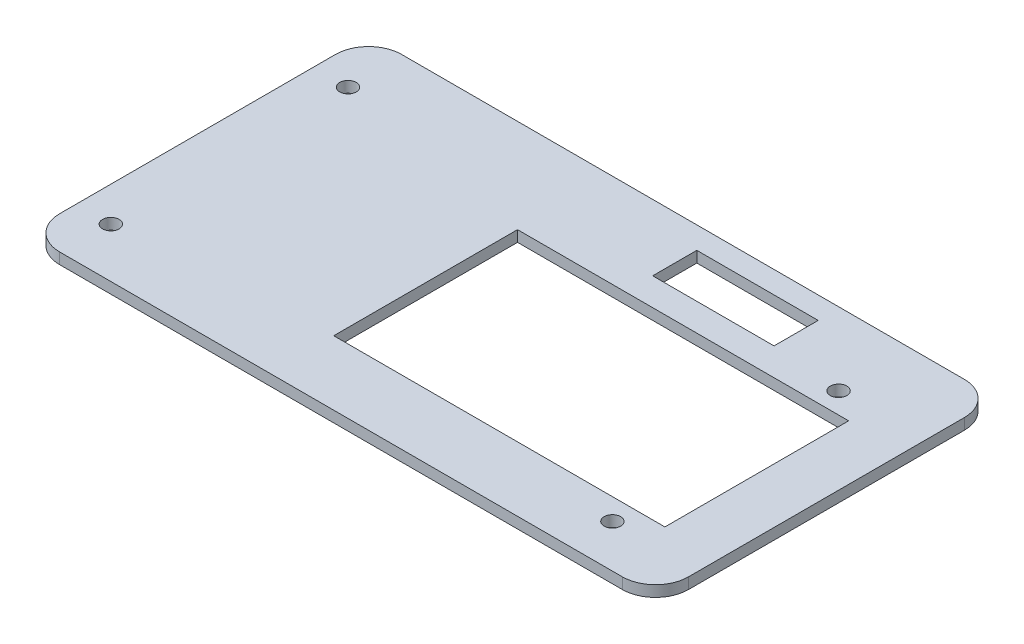
ISO-10303-21;
HEADER;
FILE_DESCRIPTION(('STEP AP214'),'2;1');
FILE_NAME('part.step','',(''),(''),'','','');
FILE_SCHEMA(('AUTOMOTIVE_DESIGN { 1 0 10303 214 1 1 1 1 }'));
ENDSEC;
DATA;
#1=APPLICATION_CONTEXT('core data for automotive mechanical design processes');
#2=APPLICATION_PROTOCOL_DEFINITION('international standard','automotive_design',2000,#1);
#3=PRODUCT_CONTEXT('',#1,'mechanical');
#4=PRODUCT('Part','Part','',(#3));
#5=PRODUCT_RELATED_PRODUCT_CATEGORY('part','',(#4));
#6=PRODUCT_DEFINITION_FORMATION('','',#4);
#7=PRODUCT_DEFINITION_CONTEXT('part definition',#1,'design');
#8=PRODUCT_DEFINITION('design','',#6,#7);
#9=PRODUCT_DEFINITION_SHAPE('','',#8);
#10=(LENGTH_UNIT() NAMED_UNIT(*) SI_UNIT(.MILLI.,.METRE.));
#11=(NAMED_UNIT(*) PLANE_ANGLE_UNIT() SI_UNIT($,.RADIAN.));
#12=(NAMED_UNIT(*) SI_UNIT($,.STERADIAN.) SOLID_ANGLE_UNIT());
#13=UNCERTAINTY_MEASURE_WITH_UNIT(LENGTH_MEASURE(1.E-05),#10,'distance_accuracy_value','');
#14=(GEOMETRIC_REPRESENTATION_CONTEXT(3) GLOBAL_UNCERTAINTY_ASSIGNED_CONTEXT((#13)) GLOBAL_UNIT_ASSIGNED_CONTEXT((#10,
#11,#12)) REPRESENTATION_CONTEXT('',''));
#15=CARTESIAN_POINT('',(0.,0.,0.));
#16=DIRECTION('',(0.,0.,1.));
#17=DIRECTION('',(1.,0.,0.));
#18=AXIS2_PLACEMENT_3D('',#15,#16,#17);
#19=CARTESIAN_POINT('',(0.,2.00000000000009,0.));
#20=DIRECTION('',(0.,-0.999999999999999,0.));
#21=DIRECTION('',(0.,0.,-0.999999999999998));
#22=AXIS2_PLACEMENT_3D('',#19,#20,#21);
#23=PLANE('',#22);
#24=CARTESIAN_POINT('',(15.9,2.00000000000007,-17.8));
#25=DIRECTION('',(0.,-0.999999999999999,0.));
#26=DIRECTION('',(0.,0.,-0.999999999999998));
#27=AXIS2_PLACEMENT_3D('',#24,#25,#26);
#28=CIRCLE('',#27,1.5);
#29=CARTESIAN_POINT('',(15.9,2.00000000000007,-16.3));
#30=VERTEX_POINT('',#29);
#31=EDGE_CURVE('E273',#30,#30,#28,.T.);
#32=ORIENTED_EDGE('',*,*,#31,.T.);
#33=EDGE_LOOP('',(#32));
#34=FACE_BOUND('',#33,.T.);
#35=CARTESIAN_POINT('',(15.8999999999999,2.00000000000009,23.2));
#36=DIRECTION('',(0.,-0.999999999999999,0.));
#37=DIRECTION('',(0.,0.,-0.999999999999998));
#38=AXIS2_PLACEMENT_3D('',#35,#36,#37);
#39=CIRCLE('',#38,1.5);
#40=CARTESIAN_POINT('',(15.8999999999999,2.00000000000009,24.7));
#41=VERTEX_POINT('',#40);
#42=EDGE_CURVE('E269',#41,#41,#39,.T.);
#43=ORIENTED_EDGE('',*,*,#42,.T.);
#44=EDGE_LOOP('',(#43));
#45=FACE_BOUND('',#44,.T.);
#46=CARTESIAN_POINT('',(-76.22,2.,-21.));
#47=DIRECTION('',(0.,-0.999999999999999,0.));
#48=DIRECTION('',(0.,0.,-0.999999999999998));
#49=AXIS2_PLACEMENT_3D('',#46,#47,#48);
#50=CIRCLE('',#49,1.5);
#51=CARTESIAN_POINT('',(-76.22,2.,-19.5));
#52=VERTEX_POINT('',#51);
#53=EDGE_CURVE('E265',#52,#52,#50,.T.);
#54=ORIENTED_EDGE('',*,*,#53,.T.);
#55=EDGE_LOOP('',(#54));
#56=FACE_BOUND('',#55,.T.);
#57=CARTESIAN_POINT('',(-76.22,2.00000000000009,22.));
#58=DIRECTION('',(0.,-0.999999999999999,0.));
#59=DIRECTION('',(0.,0.,-0.999999999999998));
#60=AXIS2_PLACEMENT_3D('',#57,#58,#59);
#61=CIRCLE('',#60,1.5);
#62=CARTESIAN_POINT('',(-76.22,2.00000000000009,23.5000000000001));
#63=VERTEX_POINT('',#62);
#64=EDGE_CURVE('E189',#63,#63,#61,.T.);
#65=ORIENTED_EDGE('',*,*,#64,.T.);
#66=EDGE_LOOP('',(#65));
#67=FACE_BOUND('',#66,.T.);
#68=DIRECTION('',(0.,0.,0.999999999999998));
#69=VECTOR('',#68,1.);
#70=CARTESIAN_POINT('',(-38.5,2.,19.3123275634379));
#71=LINE('',#70,#69);
#72=CARTESIAN_POINT('',(-38.5,2.,-13.9999999999999));
#73=VERTEX_POINT('',#72);
#74=CARTESIAN_POINT('',(-38.5,2.,19.3123275634379));
#75=VERTEX_POINT('',#74);
#76=EDGE_CURVE('E201',#73,#75,#71,.T.);
#77=ORIENTED_EDGE('',*,*,#76,.F.);
#78=DIRECTION('',(-0.999999999999999,0.,0.));
#79=VECTOR('',#78,1.);
#80=CARTESIAN_POINT('',(-38.5,2.,-13.9999999999999));
#81=LINE('',#80,#79);
#82=CARTESIAN_POINT('',(21.5265571823158,2.,-14.));
#83=VERTEX_POINT('',#82);
#84=EDGE_CURVE('E209',#83,#73,#81,.T.);
#85=ORIENTED_EDGE('',*,*,#84,.F.);
#86=DIRECTION('',(0.,0.,-0.999999999999998));
#87=VECTOR('',#86,1.);
#88=CARTESIAN_POINT('',(21.5265571823158,2.00000000000009,19.3123275634379));
#89=LINE('',#88,#87);
#90=CARTESIAN_POINT('',(21.5265571823158,2.00000000000009,19.3123275634379));
#91=VERTEX_POINT('',#90);
#92=EDGE_CURVE('E206',#91,#83,#89,.T.);
#93=ORIENTED_EDGE('',*,*,#92,.F.);
#94=DIRECTION('',(0.999999999999999,0.,0.));
#95=VECTOR('',#94,1.);
#96=CARTESIAN_POINT('',(-38.5,2.,19.3123275634379));
#97=LINE('',#96,#95);
#98=EDGE_CURVE('E203',#75,#91,#97,.T.);
#99=ORIENTED_EDGE('',*,*,#98,.F.);
#100=EDGE_LOOP('',(#77,#85,#93,#99));
#101=FACE_BOUND('',#100,.T.);
#102=DIRECTION('',(0.,0.,-0.999999999999998));
#103=VECTOR('',#102,1.);
#104=CARTESIAN_POINT('',(31.5,2.,-30.9999999999999));
#105=LINE('',#104,#103);
#106=CARTESIAN_POINT('',(31.5,2.00000000000009,25.));
#107=VERTEX_POINT('',#106);
#108=CARTESIAN_POINT('',(31.5000000000001,2.00000000000009,-25.));
#109=VERTEX_POINT('',#108);
#110=EDGE_CURVE('E235',#107,#109,#105,.T.);
#111=ORIENTED_EDGE('',*,*,#110,.T.);
#112=CARTESIAN_POINT('',(25.5,2.,-25.));
#113=DIRECTION('',(0.,-0.999999999999999,0.));
#114=DIRECTION('',(0.,0.,-0.999999999999998));
#115=AXIS2_PLACEMENT_3D('',#112,#113,#114);
#116=CIRCLE('',#115,6.);
#117=CARTESIAN_POINT('',(25.5,2.00000000000007,-30.9999999999999));
#118=VERTEX_POINT('',#117);
#119=EDGE_CURVE('E296',#109,#118,#116,.F.);
#120=ORIENTED_EDGE('',*,*,#119,.T.);
#121=DIRECTION('',(-0.999999999999999,0.,0.));
#122=VECTOR('',#121,1.);
#123=CARTESIAN_POINT('',(31.5,2.,-30.9999999999999));
#124=LINE('',#123,#122);
#125=CARTESIAN_POINT('',(-76.5,2.00000000000009,-30.9999999999998));
#126=VERTEX_POINT('',#125);
#127=EDGE_CURVE('E239',#118,#126,#124,.T.);
#128=ORIENTED_EDGE('',*,*,#127,.T.);
#129=CARTESIAN_POINT('',(-76.5000000000001,2.,-24.9999999999999));
#130=DIRECTION('',(0.,-0.999999999999999,0.));
#131=DIRECTION('',(0.,0.,-0.999999999999998));
#132=AXIS2_PLACEMENT_3D('',#129,#130,#131);
#133=CIRCLE('',#132,6.);
#134=CARTESIAN_POINT('',(-82.5,2.00000000000009,-25.));
#135=VERTEX_POINT('',#134);
#136=EDGE_CURVE('E68',#126,#135,#133,.F.);
#137=ORIENTED_EDGE('',*,*,#136,.T.);
#138=DIRECTION('',(0.,0.,0.999999999999998));
#139=VECTOR('',#138,1.);
#140=CARTESIAN_POINT('',(-82.5,2.,-30.9999999999999));
#141=LINE('',#140,#139);
#142=CARTESIAN_POINT('',(-82.5,2.,25.));
#143=VERTEX_POINT('',#142);
#144=EDGE_CURVE('E241',#135,#143,#141,.T.);
#145=ORIENTED_EDGE('',*,*,#144,.T.);
#146=CARTESIAN_POINT('',(-76.5,2.00000000000009,25.));
#147=DIRECTION('',(0.,-0.999999999999999,0.));
#148=DIRECTION('',(0.,0.,-0.999999999999998));
#149=AXIS2_PLACEMENT_3D('',#146,#147,#148);
#150=CIRCLE('',#149,6.);
#151=CARTESIAN_POINT('',(-76.5000000000002,2.,31.));
#152=VERTEX_POINT('',#151);
#153=EDGE_CURVE('E291',#143,#152,#150,.F.);
#154=ORIENTED_EDGE('',*,*,#153,.T.);
#155=DIRECTION('',(0.999999999999999,0.,0.));
#156=VECTOR('',#155,1.);
#157=CARTESIAN_POINT('',(-82.5,2.,31.0000000000002));
#158=LINE('',#157,#156);
#159=CARTESIAN_POINT('',(25.5,2.00000000000007,31.));
#160=VERTEX_POINT('',#159);
#161=EDGE_CURVE('E232',#152,#160,#158,.T.);
#162=ORIENTED_EDGE('',*,*,#161,.T.);
#163=CARTESIAN_POINT('',(25.5,2.00000000000009,25.));
#164=DIRECTION('',(0.,-0.999999999999999,0.));
#165=DIRECTION('',(0.,0.,-0.999999999999998));
#166=AXIS2_PLACEMENT_3D('',#163,#164,#165);
#167=CIRCLE('',#166,6.);
#168=EDGE_CURVE('E294',#160,#107,#167,.F.);
#169=ORIENTED_EDGE('',*,*,#168,.T.);
#170=EDGE_LOOP('',(#111,#120,#128,#137,#145,#154,#162,#169));
#171=FACE_BOUND('',#170,.T.);
#172=DIRECTION('',(0.,0.,-0.999999999999998));
#173=VECTOR('',#172,1.);
#174=CARTESIAN_POINT('',(-19.,2.00000000000007,-26.9999999999999));
#175=LINE('',#174,#173);
#176=CARTESIAN_POINT('',(-19.,2.00000000000009,-19.));
#177=VERTEX_POINT('',#176);
#178=CARTESIAN_POINT('',(-19.,2.00000000000007,-26.9999999999999));
#179=VERTEX_POINT('',#178);
#180=EDGE_CURVE('E165',#177,#179,#175,.T.);
#181=ORIENTED_EDGE('',*,*,#180,.T.);
#182=DIRECTION('',(0.999999999999999,0.,0.));
#183=VECTOR('',#182,1.);
#184=CARTESIAN_POINT('',(3.,2.,-26.9999999999999));
#185=LINE('',#184,#183);
#186=CARTESIAN_POINT('',(3.,2.,-26.9999999999999));
#187=VERTEX_POINT('',#186);
#188=EDGE_CURVE('E175',#179,#187,#185,.T.);
#189=ORIENTED_EDGE('',*,*,#188,.T.);
#190=DIRECTION('',(0.,0.,0.999999999999998));
#191=VECTOR('',#190,1.);
#192=CARTESIAN_POINT('',(3.,2.,-19.));
#193=LINE('',#192,#191);
#194=CARTESIAN_POINT('',(3.,2.,-19.));
#195=VERTEX_POINT('',#194);
#196=EDGE_CURVE('E181',#187,#195,#193,.T.);
#197=ORIENTED_EDGE('',*,*,#196,.T.);
#198=DIRECTION('',(-0.999999999999999,0.,0.));
#199=VECTOR('',#198,1.);
#200=CARTESIAN_POINT('',(-19.,2.00000000000009,-19.));
#201=LINE('',#200,#199);
#202=EDGE_CURVE('E185',#195,#177,#201,.T.);
#203=ORIENTED_EDGE('',*,*,#202,.T.);
#204=EDGE_LOOP('',(#181,#189,#197,#203));
#205=FACE_BOUND('',#204,.T.);
#206=ADVANCED_FACE('F47',(#34,#45,#56,#67,#101,#171,#205),#23,.F.);
#207=CARTESIAN_POINT('',(0.,0.,0.));
#208=DIRECTION('',(0.,-0.999999999999999,0.));
#209=DIRECTION('',(0.,0.,-0.999999999999998));
#210=AXIS2_PLACEMENT_3D('',#207,#208,#209);
#211=PLANE('',#210);
#212=CARTESIAN_POINT('',(15.8999999999999,0.,-17.7999999999999));
#213=DIRECTION('',(0.,-0.999999999999999,0.));
#214=DIRECTION('',(0.,0.,-0.999999999999998));
#215=AXIS2_PLACEMENT_3D('',#212,#213,#214);
#216=CIRCLE('',#215,1.5);
#217=CARTESIAN_POINT('',(15.9,0.,-16.3));
#218=VERTEX_POINT('',#217);
#219=EDGE_CURVE('E270',#218,#218,#216,.F.);
#220=ORIENTED_EDGE('',*,*,#219,.T.);
#221=EDGE_LOOP('',(#220));
#222=FACE_BOUND('',#221,.T.);
#223=CARTESIAN_POINT('',(15.8999999999999,0.,23.2));
#224=DIRECTION('',(0.,-0.999999999999999,0.));
#225=DIRECTION('',(0.,0.,-0.999999999999998));
#226=AXIS2_PLACEMENT_3D('',#223,#224,#225);
#227=CIRCLE('',#226,1.5);
#228=CARTESIAN_POINT('',(15.8999999999999,0.,24.7));
#229=VERTEX_POINT('',#228);
#230=EDGE_CURVE('E266',#229,#229,#227,.F.);
#231=ORIENTED_EDGE('',*,*,#230,.T.);
#232=EDGE_LOOP('',(#231));
#233=FACE_BOUND('',#232,.T.);
#234=CARTESIAN_POINT('',(-76.22,0.,-21.));
#235=DIRECTION('',(0.,-0.999999999999999,0.));
#236=DIRECTION('',(0.,0.,-0.999999999999998));
#237=AXIS2_PLACEMENT_3D('',#234,#235,#236);
#238=CIRCLE('',#237,1.5);
#239=CARTESIAN_POINT('',(-76.22,0.,-19.5));
#240=VERTEX_POINT('',#239);
#241=EDGE_CURVE('E262',#240,#240,#238,.F.);
#242=ORIENTED_EDGE('',*,*,#241,.T.);
#243=EDGE_LOOP('',(#242));
#244=FACE_BOUND('',#243,.T.);
#245=CARTESIAN_POINT('',(-76.22,0.,21.9999999999999));
#246=DIRECTION('',(0.,-0.999999999999999,0.));
#247=DIRECTION('',(0.,0.,-0.999999999999998));
#248=AXIS2_PLACEMENT_3D('',#245,#246,#247);
#249=CIRCLE('',#248,1.5);
#250=CARTESIAN_POINT('',(-76.22,0.,23.5000000000001));
#251=VERTEX_POINT('',#250);
#252=EDGE_CURVE('E186',#251,#251,#249,.F.);
#253=ORIENTED_EDGE('',*,*,#252,.T.);
#254=EDGE_LOOP('',(#253));
#255=FACE_BOUND('',#254,.T.);
#256=DIRECTION('',(-0.999999999999999,0.,0.));
#257=VECTOR('',#256,1.);
#258=CARTESIAN_POINT('',(-31.5,0.,-30.9999999999999));
#259=LINE('',#258,#257);
#260=CARTESIAN_POINT('',(25.5,0.,-30.9999999999999));
#261=VERTEX_POINT('',#260);
#262=CARTESIAN_POINT('',(-76.5,0.,-30.9999999999998));
#263=VERTEX_POINT('',#262);
#264=EDGE_CURVE('E249',#261,#263,#259,.T.);
#265=ORIENTED_EDGE('',*,*,#264,.F.);
#266=CARTESIAN_POINT('',(25.5,0.,-25.));
#267=DIRECTION('',(0.,-0.999999999999999,0.));
#268=DIRECTION('',(0.,0.,-0.999999999999998));
#269=AXIS2_PLACEMENT_3D('',#266,#267,#268);
#270=CIRCLE('',#269,6.);
#271=CARTESIAN_POINT('',(31.5,0.,-24.9999999999999));
#272=VERTEX_POINT('',#271);
#273=EDGE_CURVE('E284',#261,#272,#270,.T.);
#274=ORIENTED_EDGE('',*,*,#273,.T.);
#275=DIRECTION('',(0.,0.,-0.999999999999998));
#276=VECTOR('',#275,1.);
#277=CARTESIAN_POINT('',(31.5,0.,-30.9999999999998));
#278=LINE('',#277,#276);
#279=CARTESIAN_POINT('',(31.5,0.,25.));
#280=VERTEX_POINT('',#279);
#281=EDGE_CURVE('E246',#280,#272,#278,.T.);
#282=ORIENTED_EDGE('',*,*,#281,.F.);
#283=CARTESIAN_POINT('',(25.5,0.,25.));
#284=DIRECTION('',(0.,-0.999999999999999,0.));
#285=DIRECTION('',(0.,0.,-0.999999999999998));
#286=AXIS2_PLACEMENT_3D('',#283,#284,#285);
#287=CIRCLE('',#286,6.);
#288=CARTESIAN_POINT('',(25.5,0.,31.));
#289=VERTEX_POINT('',#288);
#290=EDGE_CURVE('E282',#280,#289,#287,.T.);
#291=ORIENTED_EDGE('',*,*,#290,.T.);
#292=DIRECTION('',(0.999999999999999,0.,0.));
#293=VECTOR('',#292,1.);
#294=CARTESIAN_POINT('',(-82.5,0.,31.));
#295=LINE('',#294,#293);
#296=CARTESIAN_POINT('',(-76.5000000000001,0.,31.));
#297=VERTEX_POINT('',#296);
#298=EDGE_CURVE('E231',#297,#289,#295,.T.);
#299=ORIENTED_EDGE('',*,*,#298,.F.);
#300=CARTESIAN_POINT('',(-76.5,0.,25.));
#301=DIRECTION('',(0.,-0.999999999999999,0.));
#302=DIRECTION('',(0.,0.,-0.999999999999998));
#303=AXIS2_PLACEMENT_3D('',#300,#301,#302);
#304=CIRCLE('',#303,6.);
#305=CARTESIAN_POINT('',(-82.4999999999999,0.,25.));
#306=VERTEX_POINT('',#305);
#307=EDGE_CURVE('E278',#297,#306,#304,.T.);
#308=ORIENTED_EDGE('',*,*,#307,.T.);
#309=DIRECTION('',(0.,0.,0.999999999999998));
#310=VECTOR('',#309,1.);
#311=CARTESIAN_POINT('',(-82.5,0.,31.));
#312=LINE('',#311,#310);
#313=CARTESIAN_POINT('',(-82.5,0.,-24.9999999999999));
#314=VERTEX_POINT('',#313);
#315=EDGE_CURVE('E236',#314,#306,#312,.T.);
#316=ORIENTED_EDGE('',*,*,#315,.F.);
#317=CARTESIAN_POINT('',(-76.5,0.,-25.));
#318=DIRECTION('',(0.,-0.999999999999999,0.));
#319=DIRECTION('',(0.,0.,-0.999999999999998));
#320=AXIS2_PLACEMENT_3D('',#317,#318,#319);
#321=CIRCLE('',#320,6.);
#322=EDGE_CURVE('E280',#314,#263,#321,.T.);
#323=ORIENTED_EDGE('',*,*,#322,.T.);
#324=EDGE_LOOP('',(#265,#274,#282,#291,#299,#308,#316,#323));
#325=FACE_BOUND('',#324,.T.);
#326=DIRECTION('',(-0.999999999999999,0.,0.));
#327=VECTOR('',#326,1.);
#328=CARTESIAN_POINT('',(-38.5,0.,-14.));
#329=LINE('',#328,#327);
#330=CARTESIAN_POINT('',(21.5265571823158,0.,-14.));
#331=VERTEX_POINT('',#330);
#332=CARTESIAN_POINT('',(-38.5,0.,-14.));
#333=VERTEX_POINT('',#332);
#334=EDGE_CURVE('E204',#331,#333,#329,.T.);
#335=ORIENTED_EDGE('',*,*,#334,.T.);
#336=DIRECTION('',(0.,0.,0.999999999999998));
#337=VECTOR('',#336,1.);
#338=CARTESIAN_POINT('',(-38.5,0.,19.3123275634379));
#339=LINE('',#338,#337);
#340=CARTESIAN_POINT('',(-38.5,0.,19.3123275634379));
#341=VERTEX_POINT('',#340);
#342=EDGE_CURVE('E171',#333,#341,#339,.T.);
#343=ORIENTED_EDGE('',*,*,#342,.T.);
#344=DIRECTION('',(0.999999999999999,0.,0.));
#345=VECTOR('',#344,1.);
#346=CARTESIAN_POINT('',(-38.5,0.,19.3123275634379));
#347=LINE('',#346,#345);
#348=CARTESIAN_POINT('',(21.5265571823158,0.,19.3123275634379));
#349=VERTEX_POINT('',#348);
#350=EDGE_CURVE('E214',#341,#349,#347,.T.);
#351=ORIENTED_EDGE('',*,*,#350,.T.);
#352=DIRECTION('',(0.,0.,-0.999999999999998));
#353=VECTOR('',#352,1.);
#354=CARTESIAN_POINT('',(21.5265571823158,0.,19.3123275634379));
#355=LINE('',#354,#353);
#356=EDGE_CURVE('E217',#349,#331,#355,.T.);
#357=ORIENTED_EDGE('',*,*,#356,.T.);
#358=EDGE_LOOP('',(#335,#343,#351,#357));
#359=FACE_BOUND('',#358,.T.);
#360=DIRECTION('',(-0.999999999999999,0.,0.));
#361=VECTOR('',#360,1.);
#362=CARTESIAN_POINT('',(0.,0.,-26.9999999999998));
#363=LINE('',#362,#361);
#364=CARTESIAN_POINT('',(3.,0.,-26.9999999999998));
#365=VERTEX_POINT('',#364);
#366=CARTESIAN_POINT('',(-19.,0.,-26.9999999999998));
#367=VERTEX_POINT('',#366);
#368=EDGE_CURVE('E258',#365,#367,#363,.T.);
#369=ORIENTED_EDGE('',*,*,#368,.T.);
#370=DIRECTION('',(0.,0.,0.999999999999998));
#371=VECTOR('',#370,1.);
#372=CARTESIAN_POINT('',(-19.,0.,0.));
#373=LINE('',#372,#371);
#374=CARTESIAN_POINT('',(-19.,0.,-19.));
#375=VERTEX_POINT('',#374);
#376=EDGE_CURVE('E168',#367,#375,#373,.T.);
#377=ORIENTED_EDGE('',*,*,#376,.T.);
#378=DIRECTION('',(0.999999999999999,0.,0.));
#379=VECTOR('',#378,1.);
#380=CARTESIAN_POINT('',(0.,0.,-19.));
#381=LINE('',#380,#379);
#382=CARTESIAN_POINT('',(3.,0.,-19.));
#383=VERTEX_POINT('',#382);
#384=EDGE_CURVE('E243',#375,#383,#381,.T.);
#385=ORIENTED_EDGE('',*,*,#384,.T.);
#386=DIRECTION('',(0.,0.,-0.999999999999998));
#387=VECTOR('',#386,1.);
#388=CARTESIAN_POINT('',(3.00000000000004,0.,0.));
#389=LINE('',#388,#387);
#390=EDGE_CURVE('E255',#383,#365,#389,.T.);
#391=ORIENTED_EDGE('',*,*,#390,.T.);
#392=EDGE_LOOP('',(#369,#377,#385,#391));
#393=FACE_BOUND('',#392,.T.);
#394=ADVANCED_FACE('F320',(#222,#233,#244,#255,#325,#359,#393),#211,.T.);
#395=CARTESIAN_POINT('',(-82.5,2.,31.0000000000002));
#396=DIRECTION('',(0.,0.,-0.999999999999998));
#397=DIRECTION('',(-0.999999999999999,0.,0.));
#398=AXIS2_PLACEMENT_3D('',#395,#396,#397);
#399=PLANE('',#398);
#400=ORIENTED_EDGE('',*,*,#298,.T.);
#401=DIRECTION('',(0.,-0.999999999999999,0.));
#402=VECTOR('',#401,1.);
#403=CARTESIAN_POINT('',(25.5,2.00000000000007,31.));
#404=LINE('',#403,#402);
#405=EDGE_CURVE('E301',#289,#160,#404,.F.);
#406=ORIENTED_EDGE('',*,*,#405,.T.);
#407=ORIENTED_EDGE('',*,*,#161,.F.);
#408=DIRECTION('',(0.,-0.999999999999999,0.));
#409=VECTOR('',#408,1.);
#410=CARTESIAN_POINT('',(-76.5000000000002,2.,31.));
#411=LINE('',#410,#409);
#412=EDGE_CURVE('E298',#152,#297,#411,.T.);
#413=ORIENTED_EDGE('',*,*,#412,.T.);
#414=EDGE_LOOP('',(#400,#406,#407,#413));
#415=FACE_BOUND('',#414,.T.);
#416=ADVANCED_FACE('F305',(#415),#399,.F.);
#417=CARTESIAN_POINT('',(31.5,2.,-30.9999999999999));
#418=DIRECTION('',(-0.999999999999999,0.,0.));
#419=DIRECTION('',(0.,0.,0.999999999999998));
#420=AXIS2_PLACEMENT_3D('',#417,#418,#419);
#421=PLANE('',#420);
#422=ORIENTED_EDGE('',*,*,#281,.T.);
#423=DIRECTION('',(0.,-0.999999999999999,0.));
#424=VECTOR('',#423,1.);
#425=CARTESIAN_POINT('',(31.5000000000001,2.00000000000009,-25.));
#426=LINE('',#425,#424);
#427=EDGE_CURVE('E289',#272,#109,#426,.F.);
#428=ORIENTED_EDGE('',*,*,#427,.T.);
#429=ORIENTED_EDGE('',*,*,#110,.F.);
#430=DIRECTION('',(0.,-0.999999999999999,0.));
#431=VECTOR('',#430,1.);
#432=CARTESIAN_POINT('',(31.5,2.00000000000009,25.));
#433=LINE('',#432,#431);
#434=EDGE_CURVE('E286',#107,#280,#433,.T.);
#435=ORIENTED_EDGE('',*,*,#434,.T.);
#436=EDGE_LOOP('',(#422,#428,#429,#435));
#437=FACE_BOUND('',#436,.T.);
#438=ADVANCED_FACE('F316',(#437),#421,.F.);
#439=CARTESIAN_POINT('',(-31.5,2.00000000000009,-30.9999999999999));
#440=DIRECTION('',(0.,0.,0.999999999999998));
#441=DIRECTION('',(0.999999999999999,0.,0.));
#442=AXIS2_PLACEMENT_3D('',#439,#440,#441);
#443=PLANE('',#442);
#444=ORIENTED_EDGE('',*,*,#127,.F.);
#445=DIRECTION('',(0.,-0.999999999999999,0.));
#446=VECTOR('',#445,1.);
#447=CARTESIAN_POINT('',(25.5,2.00000000000007,-30.9999999999999));
#448=LINE('',#447,#446);
#449=EDGE_CURVE('E275',#118,#261,#448,.T.);
#450=ORIENTED_EDGE('',*,*,#449,.T.);
#451=ORIENTED_EDGE('',*,*,#264,.T.);
#452=DIRECTION('',(0.,-0.999999999999999,0.));
#453=VECTOR('',#452,1.);
#454=CARTESIAN_POINT('',(-76.5,2.00000000000009,-30.9999999999998));
#455=LINE('',#454,#453);
#456=EDGE_CURVE('E260',#263,#126,#455,.F.);
#457=ORIENTED_EDGE('',*,*,#456,.T.);
#458=EDGE_LOOP('',(#444,#450,#451,#457));
#459=FACE_BOUND('',#458,.T.);
#460=ADVANCED_FACE('F328',(#459),#443,.F.);
#461=CARTESIAN_POINT('',(-82.5,2.,31.0000000000002));
#462=DIRECTION('',(0.999999999999999,0.,0.));
#463=DIRECTION('',(0.,0.,-0.999999999999998));
#464=AXIS2_PLACEMENT_3D('',#461,#462,#463);
#465=PLANE('',#464);
#466=ORIENTED_EDGE('',*,*,#144,.F.);
#467=DIRECTION('',(0.,-0.999999999999999,0.));
#468=VECTOR('',#467,1.);
#469=CARTESIAN_POINT('',(-82.5,2.00000000000009,-25.));
#470=LINE('',#469,#468);
#471=EDGE_CURVE('E13',#135,#314,#470,.T.);
#472=ORIENTED_EDGE('',*,*,#471,.T.);
#473=ORIENTED_EDGE('',*,*,#315,.T.);
#474=DIRECTION('',(0.,-0.999999999999999,0.));
#475=VECTOR('',#474,1.);
#476=CARTESIAN_POINT('',(-82.5,2.,25.));
#477=LINE('',#476,#475);
#478=EDGE_CURVE('E55',#306,#143,#477,.F.);
#479=ORIENTED_EDGE('',*,*,#478,.T.);
#480=EDGE_LOOP('',(#466,#472,#473,#479));
#481=FACE_BOUND('',#480,.T.);
#482=ADVANCED_FACE('F334',(#481),#465,.F.);
#483=CARTESIAN_POINT('',(-38.5,2.,19.3123275634379));
#484=DIRECTION('',(0.999999999999999,0.,0.));
#485=DIRECTION('',(0.,0.,-0.999999999999998));
#486=AXIS2_PLACEMENT_3D('',#483,#484,#485);
#487=PLANE('',#486);
#488=ORIENTED_EDGE('',*,*,#342,.F.);
#489=DIRECTION('',(0.,-0.999999999999999,0.));
#490=VECTOR('',#489,1.);
#491=CARTESIAN_POINT('',(-38.5,2.,-13.9999999999999));
#492=LINE('',#491,#490);
#493=EDGE_CURVE('E211',#73,#333,#492,.T.);
#494=ORIENTED_EDGE('',*,*,#493,.F.);
#495=ORIENTED_EDGE('',*,*,#76,.T.);
#496=DIRECTION('',(0.,-0.999999999999999,0.));
#497=VECTOR('',#496,1.);
#498=CARTESIAN_POINT('',(-38.5,2.,19.3123275634379));
#499=LINE('',#498,#497);
#500=EDGE_CURVE('E228',#75,#341,#499,.T.);
#501=ORIENTED_EDGE('',*,*,#500,.T.);
#502=EDGE_LOOP('',(#488,#494,#495,#501));
#503=FACE_BOUND('',#502,.T.);
#504=ADVANCED_FACE('F351',(#503),#487,.T.);
#505=CARTESIAN_POINT('',(-38.5,2.,19.3123275634379));
#506=DIRECTION('',(0.,0.,-0.999999999999998));
#507=DIRECTION('',(-0.999999999999999,0.,0.));
#508=AXIS2_PLACEMENT_3D('',#505,#506,#507);
#509=PLANE('',#508);
#510=ORIENTED_EDGE('',*,*,#350,.F.);
#511=ORIENTED_EDGE('',*,*,#500,.F.);
#512=ORIENTED_EDGE('',*,*,#98,.T.);
#513=DIRECTION('',(0.,-0.999999999999999,0.));
#514=VECTOR('',#513,1.);
#515=CARTESIAN_POINT('',(21.5265571823158,2.00000000000009,19.3123275634379));
#516=LINE('',#515,#514);
#517=EDGE_CURVE('E226',#91,#349,#516,.T.);
#518=ORIENTED_EDGE('',*,*,#517,.T.);
#519=EDGE_LOOP('',(#510,#511,#512,#518));
#520=FACE_BOUND('',#519,.T.);
#521=ADVANCED_FACE('F453',(#520),#509,.T.);
#522=CARTESIAN_POINT('',(21.5265571823158,2.00000000000009,19.3123275634379));
#523=DIRECTION('',(-0.999999999999999,0.,0.));
#524=DIRECTION('',(0.,0.,0.999999999999998));
#525=AXIS2_PLACEMENT_3D('',#522,#523,#524);
#526=PLANE('',#525);
#527=ORIENTED_EDGE('',*,*,#356,.F.);
#528=ORIENTED_EDGE('',*,*,#517,.F.);
#529=ORIENTED_EDGE('',*,*,#92,.T.);
#530=DIRECTION('',(0.,-0.999999999999999,0.));
#531=VECTOR('',#530,1.);
#532=CARTESIAN_POINT('',(21.5265571823158,2.,-14.));
#533=LINE('',#532,#531);
#534=EDGE_CURVE('E224',#83,#331,#533,.T.);
#535=ORIENTED_EDGE('',*,*,#534,.T.);
#536=EDGE_LOOP('',(#527,#528,#529,#535));
#537=FACE_BOUND('',#536,.T.);
#538=ADVANCED_FACE('F444',(#537),#526,.T.);
#539=CARTESIAN_POINT('',(-38.5,2.,-13.9999999999999));
#540=DIRECTION('',(0.,0.,0.999999999999998));
#541=DIRECTION('',(0.999999999999999,0.,0.));
#542=AXIS2_PLACEMENT_3D('',#539,#540,#541);
#543=PLANE('',#542);
#544=ORIENTED_EDGE('',*,*,#334,.F.);
#545=ORIENTED_EDGE('',*,*,#534,.F.);
#546=ORIENTED_EDGE('',*,*,#84,.T.);
#547=ORIENTED_EDGE('',*,*,#493,.T.);
#548=EDGE_LOOP('',(#544,#545,#546,#547));
#549=FACE_BOUND('',#548,.T.);
#550=ADVANCED_FACE('F437',(#549),#543,.T.);
#551=CARTESIAN_POINT('',(-19.,-7.99999999999992,-26.9999999999998));
#552=DIRECTION('',(0.999999999999999,0.,0.));
#553=DIRECTION('',(0.,0.,-0.999999999999998));
#554=AXIS2_PLACEMENT_3D('',#551,#552,#553);
#555=PLANE('',#554);
#556=DIRECTION('',(0.,0.999999999999999,0.));
#557=VECTOR('',#556,1.);
#558=CARTESIAN_POINT('',(-19.,-7.99999999999992,-26.9999999999998));
#559=LINE('',#558,#557);
#560=EDGE_CURVE('E160',#367,#179,#559,.T.);
#561=ORIENTED_EDGE('',*,*,#560,.T.);
#562=ORIENTED_EDGE('',*,*,#180,.F.);
#563=DIRECTION('',(0.,0.999999999999999,0.));
#564=VECTOR('',#563,1.);
#565=CARTESIAN_POINT('',(-19.,-7.99999999999998,-19.));
#566=LINE('',#565,#564);
#567=EDGE_CURVE('E196',#375,#177,#566,.T.);
#568=ORIENTED_EDGE('',*,*,#567,.F.);
#569=ORIENTED_EDGE('',*,*,#376,.F.);
#570=EDGE_LOOP('',(#561,#562,#568,#569));
#571=FACE_BOUND('',#570,.T.);
#572=ADVANCED_FACE('F162',(#571),#555,.T.);
#573=CARTESIAN_POINT('',(3.00000000000004,-7.99999999999991,-26.9999999999998));
#574=DIRECTION('',(0.,0.,0.999999999999998));
#575=DIRECTION('',(0.999999999999999,0.,0.));
#576=AXIS2_PLACEMENT_3D('',#573,#574,#575);
#577=PLANE('',#576);
#578=DIRECTION('',(0.,0.999999999999999,0.));
#579=VECTOR('',#578,1.);
#580=CARTESIAN_POINT('',(3.00000000000004,-7.99999999999991,-26.9999999999998));
#581=LINE('',#580,#579);
#582=EDGE_CURVE('E172',#365,#187,#581,.T.);
#583=ORIENTED_EDGE('',*,*,#582,.T.);
#584=ORIENTED_EDGE('',*,*,#188,.F.);
#585=ORIENTED_EDGE('',*,*,#560,.F.);
#586=ORIENTED_EDGE('',*,*,#368,.F.);
#587=EDGE_LOOP('',(#583,#584,#585,#586));
#588=FACE_BOUND('',#587,.T.);
#589=ADVANCED_FACE('F176',(#588),#577,.T.);
#590=CARTESIAN_POINT('',(3.,-8.00000000000001,-19.));
#591=DIRECTION('',(-0.999999999999999,0.,0.));
#592=DIRECTION('',(0.,0.,0.999999999999998));
#593=AXIS2_PLACEMENT_3D('',#590,#591,#592);
#594=PLANE('',#593);
#595=DIRECTION('',(0.,0.999999999999999,0.));
#596=VECTOR('',#595,1.);
#597=CARTESIAN_POINT('',(3.,-8.00000000000001,-19.));
#598=LINE('',#597,#596);
#599=EDGE_CURVE('E198',#383,#195,#598,.T.);
#600=ORIENTED_EDGE('',*,*,#599,.T.);
#601=ORIENTED_EDGE('',*,*,#196,.F.);
#602=ORIENTED_EDGE('',*,*,#582,.F.);
#603=ORIENTED_EDGE('',*,*,#390,.F.);
#604=EDGE_LOOP('',(#600,#601,#602,#603));
#605=FACE_BOUND('',#604,.T.);
#606=ADVANCED_FACE('F416',(#605),#594,.T.);
#607=CARTESIAN_POINT('',(-19.,-7.99999999999998,-19.));
#608=DIRECTION('',(0.,0.,-0.999999999999998));
#609=DIRECTION('',(-0.999999999999999,0.,0.));
#610=AXIS2_PLACEMENT_3D('',#607,#608,#609);
#611=PLANE('',#610);
#612=ORIENTED_EDGE('',*,*,#567,.T.);
#613=ORIENTED_EDGE('',*,*,#202,.F.);
#614=ORIENTED_EDGE('',*,*,#599,.F.);
#615=ORIENTED_EDGE('',*,*,#384,.F.);
#616=EDGE_LOOP('',(#612,#613,#614,#615));
#617=FACE_BOUND('',#616,.T.);
#618=ADVANCED_FACE('F408',(#617),#611,.T.);
#619=CARTESIAN_POINT('',(-76.22,-7.99999999999992,22.0000000000001));
#620=DIRECTION('',(0.,0.999999999999999,0.));
#621=DIRECTION('',(0.,0.,0.999999999999998));
#622=AXIS2_PLACEMENT_3D('',#619,#620,#621);
#623=CYLINDRICAL_SURFACE('',#622,1.5);
#624=CARTESIAN_POINT('',(-76.22,0.,23.5000000000001));
#625=CARTESIAN_POINT('',(-76.22,0.0208333333333345,23.5000000000001));
#626=CARTESIAN_POINT('',(-76.22,0.041666666666669,23.5000000000001));
#627=CARTESIAN_POINT('',(-76.22,0.0833333333333374,23.5000000000001));
#628=CARTESIAN_POINT('',(-76.22,0.104166666666671,23.5000000000001));
#629=CARTESIAN_POINT('',(-76.22,0.14583333333334,23.5000000000001));
#630=CARTESIAN_POINT('',(-76.22,0.166666666666674,23.5000000000001));
#631=CARTESIAN_POINT('',(-76.22,0.208333333333343,23.5000000000001));
#632=CARTESIAN_POINT('',(-76.22,0.229166666666677,23.5000000000001));
#633=CARTESIAN_POINT('',(-76.22,0.270833333333345,23.5000000000001));
#634=CARTESIAN_POINT('',(-76.22,0.29166666666668,23.5000000000001));
#635=CARTESIAN_POINT('',(-76.22,0.333333333333348,23.5000000000001));
#636=CARTESIAN_POINT('',(-76.22,0.354166666666682,23.5000000000001));
#637=CARTESIAN_POINT('',(-76.22,0.39583333333335,23.5000000000001));
#638=CARTESIAN_POINT('',(-76.22,0.416666666666685,23.5000000000001));
#639=CARTESIAN_POINT('',(-76.22,0.458333333333353,23.5000000000001));
#640=CARTESIAN_POINT('',(-76.22,0.479166666666686,23.5000000000001));
#641=CARTESIAN_POINT('',(-76.22,0.520833333333354,23.5000000000001));
#642=CARTESIAN_POINT('',(-76.22,0.541666666666689,23.5000000000001));
#643=CARTESIAN_POINT('',(-76.22,0.583333333333358,23.5000000000001));
#644=CARTESIAN_POINT('',(-76.22,0.604166666666692,23.5000000000001));
#645=CARTESIAN_POINT('',(-76.22,0.645833333333361,23.5000000000001));
#646=CARTESIAN_POINT('',(-76.22,0.666666666666694,23.5000000000001));
#647=CARTESIAN_POINT('',(-76.22,0.708333333333363,23.5000000000001));
#648=CARTESIAN_POINT('',(-76.22,0.729166666666697,23.5000000000001));
#649=CARTESIAN_POINT('',(-76.22,0.770833333333366,23.5000000000001));
#650=CARTESIAN_POINT('',(-76.22,0.7916666666667,23.5000000000001));
#651=CARTESIAN_POINT('',(-76.22,0.833333333333368,23.5000000000001));
#652=CARTESIAN_POINT('',(-76.22,0.854166666666703,23.5000000000001));
#653=CARTESIAN_POINT('',(-76.22,0.895833333333371,23.5000000000001));
#654=CARTESIAN_POINT('',(-76.22,0.916666666666705,23.5000000000001));
#655=CARTESIAN_POINT('',(-76.22,0.958333333333373,23.5000000000001));
#656=CARTESIAN_POINT('',(-76.22,0.979166666666708,23.5000000000001));
#657=CARTESIAN_POINT('',(-76.22,1.02083333333338,23.5000000000001));
#658=CARTESIAN_POINT('',(-76.22,1.04166666666671,23.5000000000001));
#659=CARTESIAN_POINT('',(-76.22,1.08333333333338,23.5000000000001));
#660=CARTESIAN_POINT('',(-76.22,1.10416666666671,23.5000000000001));
#661=CARTESIAN_POINT('',(-76.22,1.14583333333338,23.5000000000001));
#662=CARTESIAN_POINT('',(-76.22,1.16666666666672,23.5000000000001));
#663=CARTESIAN_POINT('',(-76.22,1.20833333333339,23.5000000000001));
#664=CARTESIAN_POINT('',(-76.22,1.22916666666672,23.5000000000001));
#665=CARTESIAN_POINT('',(-76.22,1.27083333333339,23.5000000000001));
#666=CARTESIAN_POINT('',(-76.22,1.29166666666672,23.5000000000001));
#667=CARTESIAN_POINT('',(-76.22,1.33333333333339,23.5000000000001));
#668=CARTESIAN_POINT('',(-76.22,1.35416666666672,23.5000000000001));
#669=CARTESIAN_POINT('',(-76.22,1.39583333333339,23.5000000000001));
#670=CARTESIAN_POINT('',(-76.22,1.41666666666673,23.5000000000001));
#671=CARTESIAN_POINT('',(-76.22,1.4583333333334,23.5000000000001));
#672=CARTESIAN_POINT('',(-76.22,1.47916666666673,23.5000000000001));
#673=CARTESIAN_POINT('',(-76.22,1.5208333333334,23.5000000000001));
#674=CARTESIAN_POINT('',(-76.22,1.54166666666673,23.5000000000001));
#675=CARTESIAN_POINT('',(-76.22,1.5833333333334,23.5000000000001));
#676=CARTESIAN_POINT('',(-76.22,1.60416666666674,23.5000000000001));
#677=CARTESIAN_POINT('',(-76.22,1.6458333333334,23.5000000000001));
#678=CARTESIAN_POINT('',(-76.22,1.66666666666674,23.5000000000001));
#679=CARTESIAN_POINT('',(-76.22,1.70833333333341,23.5000000000001));
#680=CARTESIAN_POINT('',(-76.22,1.72916666666674,23.5000000000001));
#681=CARTESIAN_POINT('',(-76.22,1.77083333333341,23.5000000000001));
#682=CARTESIAN_POINT('',(-76.22,1.79166666666674,23.5000000000001));
#683=CARTESIAN_POINT('',(-76.22,1.83333333333341,23.5000000000001));
#684=CARTESIAN_POINT('',(-76.22,1.85416666666675,23.5000000000001));
#685=CARTESIAN_POINT('',(-76.22,1.89583333333341,23.5000000000001));
#686=CARTESIAN_POINT('',(-76.22,1.91666666666675,23.5000000000001));
#687=CARTESIAN_POINT('',(-76.22,1.95833333333342,23.5000000000001));
#688=CARTESIAN_POINT('',(-76.22,1.97916666666675,23.5000000000001));
#689=CARTESIAN_POINT('',(-76.22,2.00000000000009,23.5000000000001));
#690=B_SPLINE_CURVE_WITH_KNOTS('',3,(#624,#625,#626,#627,#628,#629,#630,#631,#632,#633,#634,
#635,#636,#637,#638,#639,#640,#641,#642,#643,#644,#645,#646,#647,#648,#649,#650,#651,#652,#653,
#654,#655,#656,#657,#658,#659,#660,#661,#662,#663,#664,#665,#666,#667,#668,#669,#670,#671,#672,
#673,#674,#675,#676,#677,#678,#679,#680,#681,#682,#683,#684,#685,#686,#687,#688,#689),
.UNSPECIFIED.,.F.,.F.,(4,2,2,2,2,2,2,2,2,2,2,2,2,2,2,2,2,2,2,2,2,2,2,2,2,2,2,2,2,2,2,2,4),(0.,
0.0625000000000035,0.125000000000005,0.187500000000009,0.250000000000011,0.312500000000014,
0.375000000000016,0.437500000000019,0.50000000000002,0.562500000000023,0.625000000000027,
0.687500000000028,0.750000000000032,0.812500000000034,0.875000000000037,0.937500000000039,
1.00000000000004,1.06250000000004,1.12500000000005,1.18750000000005,1.25000000000005,
1.31250000000006,1.37500000000006,1.43750000000006,1.50000000000007,1.56250000000007,
1.62500000000007,1.68750000000007,1.75000000000008,1.81250000000008,1.87500000000008,
1.93750000000008,2.00000000000009),.UNSPECIFIED.);
#691=EDGE_CURVE('BSEAM400',#251,#63,#690,.T.);
#692=ORIENTED_EDGE('',*,*,#252,.F.);
#693=ORIENTED_EDGE('',*,*,#64,.F.);
#694=ORIENTED_EDGE('',*,*,#691,.T.);
#695=ORIENTED_EDGE('',*,*,#691,.F.);
#696=EDGE_LOOP('',(#692,#694,#693,#695));
#697=FACE_BOUND('',#696,.T.);
#698=ADVANCED_FACE('F400',(#697),#623,.F.);
#699=CARTESIAN_POINT('',(-76.22,-7.99999999999999,-21.));
#700=DIRECTION('',(0.,0.999999999999999,0.));
#701=DIRECTION('',(0.,0.,0.999999999999998));
#702=AXIS2_PLACEMENT_3D('',#699,#700,#701);
#703=CYLINDRICAL_SURFACE('',#702,1.5);
#704=CARTESIAN_POINT('',(-76.22,0.,-19.5));
#705=CARTESIAN_POINT('',(-76.22,0.0208333333332513,-19.5));
#706=CARTESIAN_POINT('',(-76.22,0.0416666666665858,-19.5));
#707=CARTESIAN_POINT('',(-76.22,0.0833333333332542,-19.5));
#708=CARTESIAN_POINT('',(-76.22,0.104166666666588,-19.5));
#709=CARTESIAN_POINT('',(-76.22,0.145833333333257,-19.5));
#710=CARTESIAN_POINT('',(-76.22,0.166666666666591,-19.5));
#711=CARTESIAN_POINT('',(-76.22,0.20833333333326,-19.5));
#712=CARTESIAN_POINT('',(-76.22,0.229166666666593,-19.5));
#713=CARTESIAN_POINT('',(-76.22,0.270833333333262,-19.5));
#714=CARTESIAN_POINT('',(-76.22,0.291666666666596,-19.5));
#715=CARTESIAN_POINT('',(-76.22,0.333333333333265,-19.5));
#716=CARTESIAN_POINT('',(-76.22,0.354166666666599,-19.5));
#717=CARTESIAN_POINT('',(-76.22,0.395833333333267,-19.5));
#718=CARTESIAN_POINT('',(-76.22,0.416666666666602,-19.5));
#719=CARTESIAN_POINT('',(-76.22,0.45833333333327,-19.5));
#720=CARTESIAN_POINT('',(-76.22,0.479166666666603,-19.5));
#721=CARTESIAN_POINT('',(-76.22,0.520833333333271,-19.5));
#722=CARTESIAN_POINT('',(-76.22,0.541666666666605,-19.5));
#723=CARTESIAN_POINT('',(-76.22,0.583333333333274,-19.5));
#724=CARTESIAN_POINT('',(-76.22,0.604166666666609,-19.5));
#725=CARTESIAN_POINT('',(-76.22,0.645833333333277,-19.5));
#726=CARTESIAN_POINT('',(-76.22,0.666666666666611,-19.5));
#727=CARTESIAN_POINT('',(-76.22,0.70833333333328,-19.5));
#728=CARTESIAN_POINT('',(-76.22,0.729166666666614,-19.5));
#729=CARTESIAN_POINT('',(-76.22,0.770833333333283,-19.5));
#730=CARTESIAN_POINT('',(-76.22,0.791666666666616,-19.5));
#731=CARTESIAN_POINT('',(-76.22,0.833333333333285,-19.5));
#732=CARTESIAN_POINT('',(-76.22,0.854166666666619,-19.5));
#733=CARTESIAN_POINT('',(-76.22,0.895833333333288,-19.5));
#734=CARTESIAN_POINT('',(-76.22,0.916666666666622,-19.5));
#735=CARTESIAN_POINT('',(-76.22,0.95833333333329,-19.5));
#736=CARTESIAN_POINT('',(-76.22,0.979166666666625,-19.5));
#737=CARTESIAN_POINT('',(-76.22,1.02083333333329,-19.5));
#738=CARTESIAN_POINT('',(-76.22,1.04166666666663,-19.5));
#739=CARTESIAN_POINT('',(-76.22,1.0833333333333,-19.5));
#740=CARTESIAN_POINT('',(-76.22,1.10416666666663,-19.5));
#741=CARTESIAN_POINT('',(-76.22,1.1458333333333,-19.5));
#742=CARTESIAN_POINT('',(-76.22,1.16666666666663,-19.5));
#743=CARTESIAN_POINT('',(-76.22,1.2083333333333,-19.5));
#744=CARTESIAN_POINT('',(-76.22,1.22916666666664,-19.5));
#745=CARTESIAN_POINT('',(-76.22,1.2708333333333,-19.5));
#746=CARTESIAN_POINT('',(-76.22,1.29166666666664,-19.5));
#747=CARTESIAN_POINT('',(-76.22,1.33333333333331,-19.5));
#748=CARTESIAN_POINT('',(-76.22,1.35416666666664,-19.5));
#749=CARTESIAN_POINT('',(-76.22,1.39583333333331,-19.5));
#750=CARTESIAN_POINT('',(-76.22,1.41666666666664,-19.5));
#751=CARTESIAN_POINT('',(-76.22,1.45833333333331,-19.5));
#752=CARTESIAN_POINT('',(-76.22,1.47916666666665,-19.5));
#753=CARTESIAN_POINT('',(-76.22,1.52083333333332,-19.5));
#754=CARTESIAN_POINT('',(-76.22,1.54166666666665,-19.5));
#755=CARTESIAN_POINT('',(-76.22,1.58333333333332,-19.5));
#756=CARTESIAN_POINT('',(-76.22,1.60416666666665,-19.5));
#757=CARTESIAN_POINT('',(-76.22,1.64583333333332,-19.5));
#758=CARTESIAN_POINT('',(-76.22,1.66666666666666,-19.5));
#759=CARTESIAN_POINT('',(-76.22,1.70833333333332,-19.5));
#760=CARTESIAN_POINT('',(-76.22,1.72916666666666,-19.5));
#761=CARTESIAN_POINT('',(-76.22,1.77083333333333,-19.5));
#762=CARTESIAN_POINT('',(-76.22,1.79166666666666,-19.5));
#763=CARTESIAN_POINT('',(-76.22,1.83333333333333,-19.5));
#764=CARTESIAN_POINT('',(-76.22,1.85416666666666,-19.5));
#765=CARTESIAN_POINT('',(-76.22,1.89583333333333,-19.5));
#766=CARTESIAN_POINT('',(-76.22,1.91666666666666,-19.5));
#767=CARTESIAN_POINT('',(-76.22,1.95833333333333,-19.5));
#768=CARTESIAN_POINT('',(-76.22,1.97916666666667,-19.5));
#769=CARTESIAN_POINT('',(-76.22,2.,-19.5));
#770=B_SPLINE_CURVE_WITH_KNOTS('',3,(#704,#705,#706,#707,#708,#709,#710,#711,#712,#713,#714,
#715,#716,#717,#718,#719,#720,#721,#722,#723,#724,#725,#726,#727,#728,#729,#730,#731,#732,#733,
#734,#735,#736,#737,#738,#739,#740,#741,#742,#743,#744,#745,#746,#747,#748,#749,#750,#751,#752,
#753,#754,#755,#756,#757,#758,#759,#760,#761,#762,#763,#764,#765,#766,#767,#768,#769),
.UNSPECIFIED.,.F.,.F.,(4,2,2,2,2,2,2,2,2,2,2,2,2,2,2,2,2,2,2,2,2,2,2,2,2,2,2,2,2,2,2,2,4),(0.,
0.0625000000000035,0.125000000000005,0.187500000000009,0.250000000000011,0.312500000000014,
0.375000000000016,0.437500000000019,0.50000000000002,0.562500000000023,0.625000000000027,
0.687500000000028,0.750000000000032,0.812500000000034,0.875000000000037,0.937500000000039,
1.00000000000004,1.06250000000004,1.12500000000005,1.18750000000005,1.25000000000005,
1.31250000000006,1.37500000000006,1.43750000000006,1.50000000000007,1.56250000000007,
1.62500000000007,1.68750000000007,1.75000000000008,1.81250000000008,1.87500000000008,
1.93750000000008,2.00000000000009),.UNSPECIFIED.);
#771=EDGE_CURVE('BSEAM392',#240,#52,#770,.T.);
#772=ORIENTED_EDGE('',*,*,#241,.F.);
#773=ORIENTED_EDGE('',*,*,#53,.F.);
#774=ORIENTED_EDGE('',*,*,#771,.T.);
#775=ORIENTED_EDGE('',*,*,#771,.F.);
#776=EDGE_LOOP('',(#772,#774,#773,#775));
#777=FACE_BOUND('',#776,.T.);
#778=ADVANCED_FACE('F392',(#777),#703,.F.);
#779=CARTESIAN_POINT('',(15.8999999999999,-7.99999999999992,23.2));
#780=DIRECTION('',(0.,0.999999999999999,0.));
#781=DIRECTION('',(0.,0.,0.999999999999998));
#782=AXIS2_PLACEMENT_3D('',#779,#780,#781);
#783=CYLINDRICAL_SURFACE('',#782,1.5);
#784=CARTESIAN_POINT('',(15.8999999999999,0.,24.7));
#785=CARTESIAN_POINT('',(15.8999999999999,0.0208333333333345,24.7));
#786=CARTESIAN_POINT('',(15.8999999999999,0.041666666666669,24.7));
#787=CARTESIAN_POINT('',(15.8999999999999,0.0833333333333374,24.7));
#788=CARTESIAN_POINT('',(15.8999999999999,0.104166666666671,24.7));
#789=CARTESIAN_POINT('',(15.8999999999999,0.14583333333334,24.7));
#790=CARTESIAN_POINT('',(15.8999999999999,0.166666666666674,24.7));
#791=CARTESIAN_POINT('',(15.8999999999999,0.208333333333343,24.7));
#792=CARTESIAN_POINT('',(15.8999999999999,0.229166666666677,24.7));
#793=CARTESIAN_POINT('',(15.8999999999999,0.270833333333345,24.7));
#794=CARTESIAN_POINT('',(15.8999999999999,0.29166666666668,24.7));
#795=CARTESIAN_POINT('',(15.8999999999999,0.333333333333348,24.7));
#796=CARTESIAN_POINT('',(15.8999999999999,0.354166666666682,24.7));
#797=CARTESIAN_POINT('',(15.8999999999999,0.39583333333335,24.7));
#798=CARTESIAN_POINT('',(15.8999999999999,0.416666666666685,24.7));
#799=CARTESIAN_POINT('',(15.8999999999999,0.458333333333353,24.7));
#800=CARTESIAN_POINT('',(15.8999999999999,0.479166666666686,24.7));
#801=CARTESIAN_POINT('',(15.8999999999999,0.520833333333354,24.7));
#802=CARTESIAN_POINT('',(15.8999999999999,0.541666666666689,24.7));
#803=CARTESIAN_POINT('',(15.8999999999999,0.583333333333358,24.7));
#804=CARTESIAN_POINT('',(15.8999999999999,0.604166666666692,24.7));
#805=CARTESIAN_POINT('',(15.8999999999999,0.645833333333361,24.7));
#806=CARTESIAN_POINT('',(15.8999999999999,0.666666666666694,24.7));
#807=CARTESIAN_POINT('',(15.8999999999999,0.708333333333363,24.7));
#808=CARTESIAN_POINT('',(15.8999999999999,0.729166666666697,24.7));
#809=CARTESIAN_POINT('',(15.8999999999999,0.770833333333366,24.7));
#810=CARTESIAN_POINT('',(15.8999999999999,0.7916666666667,24.7));
#811=CARTESIAN_POINT('',(15.8999999999999,0.833333333333368,24.7));
#812=CARTESIAN_POINT('',(15.8999999999999,0.854166666666703,24.7));
#813=CARTESIAN_POINT('',(15.8999999999999,0.895833333333371,24.7));
#814=CARTESIAN_POINT('',(15.8999999999999,0.916666666666705,24.7));
#815=CARTESIAN_POINT('',(15.8999999999999,0.958333333333373,24.7));
#816=CARTESIAN_POINT('',(15.8999999999999,0.979166666666708,24.7));
#817=CARTESIAN_POINT('',(15.8999999999999,1.02083333333338,24.7));
#818=CARTESIAN_POINT('',(15.8999999999999,1.04166666666671,24.7));
#819=CARTESIAN_POINT('',(15.8999999999999,1.08333333333338,24.7));
#820=CARTESIAN_POINT('',(15.8999999999999,1.10416666666671,24.7));
#821=CARTESIAN_POINT('',(15.8999999999999,1.14583333333338,24.7));
#822=CARTESIAN_POINT('',(15.8999999999999,1.16666666666672,24.7));
#823=CARTESIAN_POINT('',(15.8999999999999,1.20833333333339,24.7));
#824=CARTESIAN_POINT('',(15.8999999999999,1.22916666666672,24.7));
#825=CARTESIAN_POINT('',(15.8999999999999,1.27083333333339,24.7));
#826=CARTESIAN_POINT('',(15.8999999999999,1.29166666666672,24.7));
#827=CARTESIAN_POINT('',(15.8999999999999,1.33333333333339,24.7));
#828=CARTESIAN_POINT('',(15.8999999999999,1.35416666666672,24.7));
#829=CARTESIAN_POINT('',(15.8999999999999,1.39583333333339,24.7));
#830=CARTESIAN_POINT('',(15.8999999999999,1.41666666666673,24.7));
#831=CARTESIAN_POINT('',(15.8999999999999,1.4583333333334,24.7));
#832=CARTESIAN_POINT('',(15.8999999999999,1.47916666666673,24.7));
#833=CARTESIAN_POINT('',(15.8999999999999,1.5208333333334,24.7));
#834=CARTESIAN_POINT('',(15.8999999999999,1.54166666666673,24.7));
#835=CARTESIAN_POINT('',(15.8999999999999,1.5833333333334,24.7));
#836=CARTESIAN_POINT('',(15.8999999999999,1.60416666666674,24.7));
#837=CARTESIAN_POINT('',(15.8999999999999,1.6458333333334,24.7));
#838=CARTESIAN_POINT('',(15.8999999999999,1.66666666666674,24.7));
#839=CARTESIAN_POINT('',(15.8999999999999,1.70833333333341,24.7));
#840=CARTESIAN_POINT('',(15.8999999999999,1.72916666666674,24.7));
#841=CARTESIAN_POINT('',(15.8999999999999,1.77083333333341,24.7));
#842=CARTESIAN_POINT('',(15.8999999999999,1.79166666666674,24.7));
#843=CARTESIAN_POINT('',(15.8999999999999,1.83333333333341,24.7));
#844=CARTESIAN_POINT('',(15.8999999999999,1.85416666666675,24.7));
#845=CARTESIAN_POINT('',(15.8999999999999,1.89583333333341,24.7));
#846=CARTESIAN_POINT('',(15.8999999999999,1.91666666666675,24.7));
#847=CARTESIAN_POINT('',(15.8999999999999,1.95833333333342,24.7));
#848=CARTESIAN_POINT('',(15.8999999999999,1.97916666666675,24.7));
#849=CARTESIAN_POINT('',(15.8999999999999,2.00000000000009,24.7));
#850=B_SPLINE_CURVE_WITH_KNOTS('',3,(#784,#785,#786,#787,#788,#789,#790,#791,#792,#793,#794,
#795,#796,#797,#798,#799,#800,#801,#802,#803,#804,#805,#806,#807,#808,#809,#810,#811,#812,#813,
#814,#815,#816,#817,#818,#819,#820,#821,#822,#823,#824,#825,#826,#827,#828,#829,#830,#831,#832,
#833,#834,#835,#836,#837,#838,#839,#840,#841,#842,#843,#844,#845,#846,#847,#848,#849),
.UNSPECIFIED.,.F.,.F.,(4,2,2,2,2,2,2,2,2,2,2,2,2,2,2,2,2,2,2,2,2,2,2,2,2,2,2,2,2,2,2,2,4),(0.,
0.0625000000000035,0.125000000000005,0.187500000000009,0.250000000000011,0.312500000000014,
0.375000000000016,0.437500000000019,0.50000000000002,0.562500000000023,0.625000000000027,
0.687500000000028,0.750000000000032,0.812500000000034,0.875000000000037,0.937500000000039,
1.00000000000004,1.06250000000004,1.12500000000005,1.18750000000005,1.25000000000005,
1.31250000000006,1.37500000000006,1.43750000000006,1.50000000000007,1.56250000000007,
1.62500000000007,1.68750000000007,1.75000000000008,1.81250000000008,1.87500000000008,
1.93750000000008,2.00000000000009),.UNSPECIFIED.);
#851=EDGE_CURVE('BSEAM384',#229,#41,#850,.T.);
#852=ORIENTED_EDGE('',*,*,#230,.F.);
#853=ORIENTED_EDGE('',*,*,#42,.F.);
#854=ORIENTED_EDGE('',*,*,#851,.T.);
#855=ORIENTED_EDGE('',*,*,#851,.F.);
#856=EDGE_LOOP('',(#852,#854,#853,#855));
#857=FACE_BOUND('',#856,.T.);
#858=ADVANCED_FACE('F384',(#857),#783,.F.);
#859=CARTESIAN_POINT('',(15.9,-7.99999999999992,-17.8));
#860=DIRECTION('',(0.,0.999999999999999,0.));
#861=DIRECTION('',(0.,0.,0.999999999999998));
#862=AXIS2_PLACEMENT_3D('',#859,#860,#861);
#863=CYLINDRICAL_SURFACE('',#862,1.5);
#864=CARTESIAN_POINT('',(15.9,0.,-16.3));
#865=CARTESIAN_POINT('',(15.9,0.0208333333332518,-16.3));
#866=CARTESIAN_POINT('',(15.9,0.0416666666665869,-16.3));
#867=CARTESIAN_POINT('',(15.9,0.0833333333332571,-16.3));
#868=CARTESIAN_POINT('',(15.9,0.104166666666592,-16.3));
#869=CARTESIAN_POINT('',(15.9,0.145833333333262,-16.3));
#870=CARTESIAN_POINT('',(15.9,0.166666666666596,-16.3));
#871=CARTESIAN_POINT('',(15.9,0.208333333333266,-16.3));
#872=CARTESIAN_POINT('',(15.9,0.229166666666601,-16.3));
#873=CARTESIAN_POINT('',(15.9,0.270833333333271,-16.3));
#874=CARTESIAN_POINT('',(15.9,0.291666666666606,-16.3));
#875=CARTESIAN_POINT('',(15.9,0.333333333333276,-16.3));
#876=CARTESIAN_POINT('',(15.9,0.354166666666611,-16.3));
#877=CARTESIAN_POINT('',(15.9,0.395833333333282,-16.3));
#878=CARTESIAN_POINT('',(15.9,0.416666666666617,-16.3));
#879=CARTESIAN_POINT('',(15.9,0.458333333333286,-16.3));
#880=CARTESIAN_POINT('',(15.9,0.47916666666662,-16.3));
#881=CARTESIAN_POINT('',(15.9,0.520833333333289,-16.3));
#882=CARTESIAN_POINT('',(15.9,0.541666666666624,-16.3));
#883=CARTESIAN_POINT('',(15.9,0.583333333333294,-16.3));
#884=CARTESIAN_POINT('',(15.9,0.604166666666629,-16.3));
#885=CARTESIAN_POINT('',(15.9,0.645833333333299,-16.3));
#886=CARTESIAN_POINT('',(15.9,0.666666666666634,-16.3));
#887=CARTESIAN_POINT('',(15.9,0.708333333333304,-16.3));
#888=CARTESIAN_POINT('',(15.9,0.72916666666664,-16.3));
#889=CARTESIAN_POINT('',(15.9,0.77083333333331,-16.3));
#890=CARTESIAN_POINT('',(15.9,0.791666666666645,-16.3));
#891=CARTESIAN_POINT('',(15.9,0.833333333333314,-16.3));
#892=CARTESIAN_POINT('',(15.9,0.854166666666649,-16.3));
#893=CARTESIAN_POINT('',(15.9,0.895833333333318,-16.3));
#894=CARTESIAN_POINT('',(15.9,0.916666666666654,-16.3));
#895=CARTESIAN_POINT('',(15.9,0.958333333333324,-16.3));
#896=CARTESIAN_POINT('',(15.9,0.979166666666659,-16.3));
#897=CARTESIAN_POINT('',(15.9,1.02083333333333,-16.3));
#898=CARTESIAN_POINT('',(15.9,1.04166666666666,-16.3));
#899=CARTESIAN_POINT('',(15.9,1.08333333333333,-16.3));
#900=CARTESIAN_POINT('',(15.9,1.10416666666667,-16.3));
#901=CARTESIAN_POINT('',(15.9,1.14583333333334,-16.3));
#902=CARTESIAN_POINT('',(15.9,1.16666666666667,-16.3));
#903=CARTESIAN_POINT('',(15.9,1.20833333333334,-16.3));
#904=CARTESIAN_POINT('',(15.9,1.22916666666668,-16.3));
#905=CARTESIAN_POINT('',(15.9,1.27083333333335,-16.3));
#906=CARTESIAN_POINT('',(15.9,1.29166666666668,-16.3));
#907=CARTESIAN_POINT('',(15.9,1.33333333333335,-16.3));
#908=CARTESIAN_POINT('',(15.9,1.35416666666669,-16.3));
#909=CARTESIAN_POINT('',(15.9,1.39583333333336,-16.3));
#910=CARTESIAN_POINT('',(15.9,1.41666666666669,-16.3));
#911=CARTESIAN_POINT('',(15.9,1.45833333333336,-16.3));
#912=CARTESIAN_POINT('',(15.9,1.4791666666667,-16.3));
#913=CARTESIAN_POINT('',(15.9,1.52083333333337,-16.3));
#914=CARTESIAN_POINT('',(15.9,1.5416666666667,-16.3));
#915=CARTESIAN_POINT('',(15.9,1.58333333333337,-16.3));
#916=CARTESIAN_POINT('',(15.9,1.60416666666671,-16.3));
#917=CARTESIAN_POINT('',(15.9,1.64583333333338,-16.3));
#918=CARTESIAN_POINT('',(15.9,1.66666666666671,-16.3));
#919=CARTESIAN_POINT('',(15.9,1.70833333333338,-16.3));
#920=CARTESIAN_POINT('',(15.9,1.72916666666672,-16.3));
#921=CARTESIAN_POINT('',(15.9,1.77083333333339,-16.3));
#922=CARTESIAN_POINT('',(15.9,1.79166666666672,-16.3));
#923=CARTESIAN_POINT('',(15.9,1.83333333333339,-16.3));
#924=CARTESIAN_POINT('',(15.9,1.85416666666673,-16.3));
#925=CARTESIAN_POINT('',(15.9,1.8958333333334,-16.3));
#926=CARTESIAN_POINT('',(15.9,1.91666666666673,-16.3));
#927=CARTESIAN_POINT('',(15.9,1.9583333333334,-16.3));
#928=CARTESIAN_POINT('',(15.9,1.97916666666674,-16.3));
#929=CARTESIAN_POINT('',(15.9,2.00000000000007,-16.3));
#930=B_SPLINE_CURVE_WITH_KNOTS('',3,(#864,#865,#866,#867,#868,#869,#870,#871,#872,#873,#874,
#875,#876,#877,#878,#879,#880,#881,#882,#883,#884,#885,#886,#887,#888,#889,#890,#891,#892,#893,
#894,#895,#896,#897,#898,#899,#900,#901,#902,#903,#904,#905,#906,#907,#908,#909,#910,#911,#912,
#913,#914,#915,#916,#917,#918,#919,#920,#921,#922,#923,#924,#925,#926,#927,#928,#929),
.UNSPECIFIED.,.F.,.F.,(4,2,2,2,2,2,2,2,2,2,2,2,2,2,2,2,2,2,2,2,2,2,2,2,2,2,2,2,2,2,2,2,4),(0.,
0.0625000000000053,0.125000000000011,0.187500000000014,0.250000000000019,0.312500000000025,
0.37500000000003,0.437500000000035,0.500000000000037,0.562500000000042,0.625000000000047,
0.687500000000053,0.750000000000058,0.812500000000063,0.875000000000067,0.937500000000072,
1.00000000000008,1.06250000000008,1.12500000000009,1.18750000000009,1.2500000000001,
1.3125000000001,1.37500000000011,1.43750000000011,1.50000000000012,1.56250000000012,
1.62500000000013,1.68750000000013,1.75000000000014,1.81250000000014,1.87500000000014,
1.93750000000015,2.00000000000015),.UNSPECIFIED.);
#931=EDGE_CURVE('BSEAM364',#218,#30,#930,.T.);
#932=ORIENTED_EDGE('',*,*,#219,.F.);
#933=ORIENTED_EDGE('',*,*,#31,.F.);
#934=ORIENTED_EDGE('',*,*,#931,.T.);
#935=ORIENTED_EDGE('',*,*,#931,.F.);
#936=EDGE_LOOP('',(#932,#934,#933,#935));
#937=FACE_BOUND('',#936,.T.);
#938=ADVANCED_FACE('F364',(#937),#863,.F.);
#939=CARTESIAN_POINT('',(25.5,2.,-25.));
#940=DIRECTION('',(0.,-0.999999999999999,0.));
#941=DIRECTION('',(0.,0.,-0.999999999999998));
#942=AXIS2_PLACEMENT_3D('',#939,#940,#941);
#943=CYLINDRICAL_SURFACE('',#942,6.);
#944=ORIENTED_EDGE('',*,*,#119,.F.);
#945=ORIENTED_EDGE('',*,*,#427,.F.);
#946=ORIENTED_EDGE('',*,*,#273,.F.);
#947=ORIENTED_EDGE('',*,*,#449,.F.);
#948=EDGE_LOOP('',(#944,#945,#946,#947));
#949=FACE_BOUND('',#948,.T.);
#950=ADVANCED_FACE('F325',(#949),#943,.T.);
#951=CARTESIAN_POINT('',(25.5,2.00000000000009,25.));
#952=DIRECTION('',(0.,-0.999999999999999,0.));
#953=DIRECTION('',(0.,0.,-0.999999999999998));
#954=AXIS2_PLACEMENT_3D('',#951,#952,#953);
#955=CYLINDRICAL_SURFACE('',#954,6.);
#956=ORIENTED_EDGE('',*,*,#168,.F.);
#957=ORIENTED_EDGE('',*,*,#405,.F.);
#958=ORIENTED_EDGE('',*,*,#290,.F.);
#959=ORIENTED_EDGE('',*,*,#434,.F.);
#960=EDGE_LOOP('',(#956,#957,#958,#959));
#961=FACE_BOUND('',#960,.T.);
#962=ADVANCED_FACE('F313',(#961),#955,.T.);
#963=CARTESIAN_POINT('',(-76.5000000000001,2.,-24.9999999999999));
#964=DIRECTION('',(0.,-0.999999999999999,0.));
#965=DIRECTION('',(0.,0.,-0.999999999999998));
#966=AXIS2_PLACEMENT_3D('',#963,#964,#965);
#967=CYLINDRICAL_SURFACE('',#966,6.);
#968=ORIENTED_EDGE('',*,*,#136,.F.);
#969=ORIENTED_EDGE('',*,*,#456,.F.);
#970=ORIENTED_EDGE('',*,*,#322,.F.);
#971=ORIENTED_EDGE('',*,*,#471,.F.);
#972=EDGE_LOOP('',(#968,#969,#970,#971));
#973=FACE_BOUND('',#972,.T.);
#974=ADVANCED_FACE('F332',(#973),#967,.T.);
#975=CARTESIAN_POINT('',(-76.5,2.00000000000009,25.));
#976=DIRECTION('',(0.,-0.999999999999999,0.));
#977=DIRECTION('',(0.,0.,-0.999999999999998));
#978=AXIS2_PLACEMENT_3D('',#975,#976,#977);
#979=CYLINDRICAL_SURFACE('',#978,6.);
#980=ORIENTED_EDGE('',*,*,#153,.F.);
#981=ORIENTED_EDGE('',*,*,#478,.F.);
#982=ORIENTED_EDGE('',*,*,#307,.F.);
#983=ORIENTED_EDGE('',*,*,#412,.F.);
#984=EDGE_LOOP('',(#980,#981,#982,#983));
#985=FACE_BOUND('',#984,.T.);
#986=ADVANCED_FACE('F49',(#985),#979,.T.);
#987=CLOSED_SHELL('',(#206,#394,#416,#438,#460,#482,#504,#521,#538,#550,#572,#589,#606,#618,
#698,#778,#858,#938,#950,#962,#974,#986));
#988=MANIFOLD_SOLID_BREP('B2',#987);
#989=ADVANCED_BREP_SHAPE_REPRESENTATION('',(#18,#988),#14);
#990=SHAPE_DEFINITION_REPRESENTATION(#9,#989);
ENDSEC;
END-ISO-10303-21;
